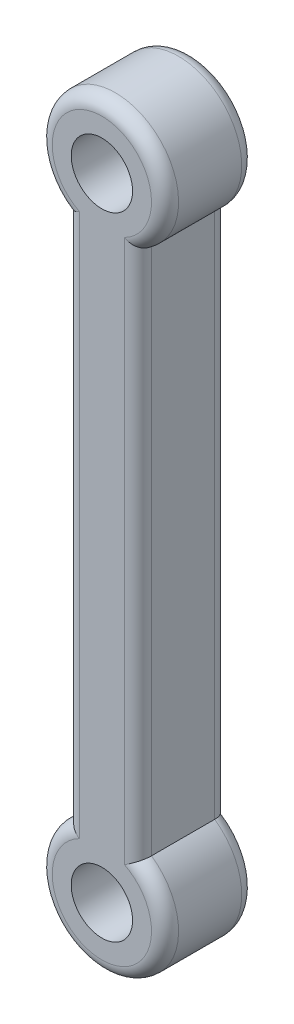
ISO-10303-21;
HEADER;
FILE_DESCRIPTION(('STEP AP214'),'2;1');
FILE_NAME('part.step','',(''),(''),'','','');
FILE_SCHEMA(('AUTOMOTIVE_DESIGN { 1 0 10303 214 1 1 1 1 }'));
ENDSEC;
DATA;
#1=APPLICATION_CONTEXT('core data for automotive mechanical design processes');
#2=APPLICATION_PROTOCOL_DEFINITION('international standard','automotive_design',2000,#1);
#3=PRODUCT_CONTEXT('',#1,'mechanical');
#4=PRODUCT('Part','Part','',(#3));
#5=PRODUCT_RELATED_PRODUCT_CATEGORY('part','',(#4));
#6=PRODUCT_DEFINITION_FORMATION('','',#4);
#7=PRODUCT_DEFINITION_CONTEXT('part definition',#1,'design');
#8=PRODUCT_DEFINITION('design','',#6,#7);
#9=PRODUCT_DEFINITION_SHAPE('','',#8);
#10=(LENGTH_UNIT() NAMED_UNIT(*) SI_UNIT(.MILLI.,.METRE.));
#11=(NAMED_UNIT(*) PLANE_ANGLE_UNIT() SI_UNIT($,.RADIAN.));
#12=(NAMED_UNIT(*) SI_UNIT($,.STERADIAN.) SOLID_ANGLE_UNIT());
#13=UNCERTAINTY_MEASURE_WITH_UNIT(LENGTH_MEASURE(1.E-05),#10,'distance_accuracy_value','');
#14=(GEOMETRIC_REPRESENTATION_CONTEXT(3) GLOBAL_UNCERTAINTY_ASSIGNED_CONTEXT((#13)) GLOBAL_UNIT_ASSIGNED_CONTEXT((#10,
#11,#12)) REPRESENTATION_CONTEXT('',''));
#15=CARTESIAN_POINT('',(0.,0.,0.));
#16=DIRECTION('',(0.,0.,1.));
#17=DIRECTION('',(1.,0.,0.));
#18=AXIS2_PLACEMENT_3D('',#15,#16,#17);
#19=CARTESIAN_POINT('',(0.,17.5,5.));
#20=DIRECTION('',(0.,0.,1.));
#21=DIRECTION('',(1.,0.,0.));
#22=AXIS2_PLACEMENT_3D('',#19,#20,#21);
#23=PLANE('',#22);
#24=CARTESIAN_POINT('',(0.,17.5,5.));
#25=DIRECTION('',(0.,0.,1.));
#26=DIRECTION('',(1.,0.,0.));
#27=AXIS2_PLACEMENT_3D('',#24,#25,#26);
#28=CIRCLE('',#27,2.75);
#29=CARTESIAN_POINT('',(1.24999999999999,15.0505102572168,5.));
#30=VERTEX_POINT('',#29);
#31=CARTESIAN_POINT('',(-1.25000000000002,15.0505102572168,5.));
#32=VERTEX_POINT('',#31);
#33=EDGE_CURVE('E66',#30,#32,#28,.T.);
#34=ORIENTED_EDGE('',*,*,#33,.T.);
#35=DIRECTION('',(0.,-1.,0.));
#36=VECTOR('',#35,1.);
#37=CARTESIAN_POINT('',(-1.25,-14.627718676731,5.));
#38=LINE('',#37,#36);
#39=CARTESIAN_POINT('',(-1.25000000000002,-15.0505102572168,5.));
#40=VERTEX_POINT('',#39);
#41=EDGE_CURVE('E11',#32,#40,#38,.T.);
#42=ORIENTED_EDGE('',*,*,#41,.T.);
#43=CARTESIAN_POINT('',(0.,-17.5,5.));
#44=DIRECTION('',(0.,0.,1.));
#45=DIRECTION('',(1.,0.,0.));
#46=AXIS2_PLACEMENT_3D('',#43,#44,#45);
#47=CIRCLE('',#46,2.75);
#48=CARTESIAN_POINT('',(1.25,-15.0505102572168,5.));
#49=VERTEX_POINT('',#48);
#50=EDGE_CURVE('E55',#40,#49,#47,.T.);
#51=ORIENTED_EDGE('',*,*,#50,.T.);
#52=DIRECTION('',(0.,1.,0.));
#53=VECTOR('',#52,1.);
#54=CARTESIAN_POINT('',(1.24999999999999,14.627718676731,5.));
#55=LINE('',#54,#53);
#56=EDGE_CURVE('E311',#49,#30,#55,.T.);
#57=ORIENTED_EDGE('',*,*,#56,.T.);
#58=EDGE_LOOP('',(#34,#42,#51,#57));
#59=FACE_BOUND('',#58,.T.);
#60=CARTESIAN_POINT('',(0.,-17.5,5.));
#61=DIRECTION('',(0.,0.,1.));
#62=DIRECTION('',(1.,0.,0.));
#63=AXIS2_PLACEMENT_3D('',#60,#61,#62);
#64=CIRCLE('',#63,1.7);
#65=CARTESIAN_POINT('',(1.69999999999999,-17.5,5.));
#66=VERTEX_POINT('',#65);
#67=EDGE_CURVE('E267',#66,#66,#64,.T.);
#68=ORIENTED_EDGE('',*,*,#67,.F.);
#69=EDGE_LOOP('',(#68));
#70=FACE_BOUND('',#69,.T.);
#71=CARTESIAN_POINT('',(0.,17.5,5.));
#72=DIRECTION('',(0.,0.,1.));
#73=DIRECTION('',(1.,0.,0.));
#74=AXIS2_PLACEMENT_3D('',#71,#72,#73);
#75=CIRCLE('',#74,1.7);
#76=CARTESIAN_POINT('',(1.69999999999999,17.5,5.));
#77=VERTEX_POINT('',#76);
#78=EDGE_CURVE('E256',#77,#77,#75,.T.);
#79=ORIENTED_EDGE('',*,*,#78,.F.);
#80=EDGE_LOOP('',(#79));
#81=FACE_BOUND('',#80,.T.);
#82=ADVANCED_FACE('F40',(#59,#70,#81),#23,.T.);
#83=CARTESIAN_POINT('',(0.,17.5,0.));
#84=DIRECTION('',(0.,0.,1.));
#85=DIRECTION('',(1.,0.,0.));
#86=AXIS2_PLACEMENT_3D('',#83,#84,#85);
#87=PLANE('',#86);
#88=DIRECTION('',(0.,-1.,0.));
#89=VECTOR('',#88,1.);
#90=CARTESIAN_POINT('',(-1.25,17.5,0.));
#91=LINE('',#90,#89);
#92=CARTESIAN_POINT('',(-1.25000000000002,-15.0505102572168,0.));
#93=VERTEX_POINT('',#92);
#94=CARTESIAN_POINT('',(-1.25000000000002,15.0505102572168,0.));
#95=VERTEX_POINT('',#94);
#96=EDGE_CURVE('E291',#93,#95,#91,.F.);
#97=ORIENTED_EDGE('',*,*,#96,.T.);
#98=CARTESIAN_POINT('',(0.,17.5,0.));
#99=DIRECTION('',(0.,0.,1.));
#100=DIRECTION('',(1.,0.,0.));
#101=AXIS2_PLACEMENT_3D('',#98,#99,#100);
#102=CIRCLE('',#101,2.75);
#103=CARTESIAN_POINT('',(1.24999999999999,15.0505102572168,0.));
#104=VERTEX_POINT('',#103);
#105=EDGE_CURVE('E123',#95,#104,#102,.F.);
#106=ORIENTED_EDGE('',*,*,#105,.T.);
#107=DIRECTION('',(0.,1.,0.));
#108=VECTOR('',#107,1.);
#109=CARTESIAN_POINT('',(1.25,17.5,0.));
#110=LINE('',#109,#108);
#111=CARTESIAN_POINT('',(1.25,-15.0505102572168,0.));
#112=VERTEX_POINT('',#111);
#113=EDGE_CURVE('E288',#104,#112,#110,.F.);
#114=ORIENTED_EDGE('',*,*,#113,.T.);
#115=CARTESIAN_POINT('',(0.,-17.5,0.));
#116=DIRECTION('',(0.,0.,1.));
#117=DIRECTION('',(1.,0.,0.));
#118=AXIS2_PLACEMENT_3D('',#115,#116,#117);
#119=CIRCLE('',#118,2.75);
#120=EDGE_CURVE('E285',#112,#93,#119,.F.);
#121=ORIENTED_EDGE('',*,*,#120,.T.);
#122=EDGE_LOOP('',(#97,#106,#114,#121));
#123=FACE_BOUND('',#122,.T.);
#124=CARTESIAN_POINT('',(0.,-17.5,0.));
#125=DIRECTION('',(0.,0.,1.));
#126=DIRECTION('',(1.,0.,0.));
#127=AXIS2_PLACEMENT_3D('',#124,#125,#126);
#128=CIRCLE('',#127,1.7);
#129=CARTESIAN_POINT('',(1.69999999999999,-17.5,0.));
#130=VERTEX_POINT('',#129);
#131=EDGE_CURVE('E264',#130,#130,#128,.T.);
#132=ORIENTED_EDGE('',*,*,#131,.T.);
#133=EDGE_LOOP('',(#132));
#134=FACE_BOUND('',#133,.T.);
#135=CARTESIAN_POINT('',(0.,17.5,0.));
#136=DIRECTION('',(0.,0.,1.));
#137=DIRECTION('',(1.,0.,0.));
#138=AXIS2_PLACEMENT_3D('',#135,#136,#137);
#139=CIRCLE('',#138,1.7);
#140=CARTESIAN_POINT('',(1.69999999999999,17.5,0.));
#141=VERTEX_POINT('',#140);
#142=EDGE_CURVE('E193',#141,#141,#139,.T.);
#143=ORIENTED_EDGE('',*,*,#142,.T.);
#144=EDGE_LOOP('',(#143));
#145=FACE_BOUND('',#144,.T.);
#146=ADVANCED_FACE('F226',(#123,#134,#145),#87,.F.);
#147=CARTESIAN_POINT('',(0.,17.5,5.));
#148=DIRECTION('',(0.,0.,-1.));
#149=DIRECTION('',(-1.,0.,0.));
#150=AXIS2_PLACEMENT_3D('',#147,#148,#149);
#151=CYLINDRICAL_SURFACE('',#150,3.5);
#152=DIRECTION('',(0.,0.,-1.));
#153=VECTOR('',#152,1.);
#154=CARTESIAN_POINT('',(1.99999999999995,14.627718676731,5.));
#155=LINE('',#154,#153);
#156=CARTESIAN_POINT('',(1.99999999999995,14.627718676731,4.25));
#157=VERTEX_POINT('',#156);
#158=CARTESIAN_POINT('',(1.99999999999995,14.627718676731,0.750000000000001));
#159=VERTEX_POINT('',#158);
#160=EDGE_CURVE('E271',#157,#159,#155,.T.);
#161=ORIENTED_EDGE('',*,*,#160,.T.);
#162=CARTESIAN_POINT('',(0.,17.5,0.750000000000001));
#163=DIRECTION('',(0.,0.,1.));
#164=DIRECTION('',(1.,0.,0.));
#165=AXIS2_PLACEMENT_3D('',#162,#163,#164);
#166=CIRCLE('',#165,3.5);
#167=CARTESIAN_POINT('',(-2.,14.627718676731,0.750000000000001));
#168=VERTEX_POINT('',#167);
#169=EDGE_CURVE('E133',#159,#168,#166,.T.);
#170=ORIENTED_EDGE('',*,*,#169,.T.);
#171=DIRECTION('',(0.,0.,-1.));
#172=VECTOR('',#171,1.);
#173=CARTESIAN_POINT('',(-2.,14.627718676731,5.));
#174=LINE('',#173,#172);
#175=CARTESIAN_POINT('',(-2.,14.627718676731,4.25));
#176=VERTEX_POINT('',#175);
#177=EDGE_CURVE('E115',#176,#168,#174,.T.);
#178=ORIENTED_EDGE('',*,*,#177,.F.);
#179=CARTESIAN_POINT('',(0.,17.5,4.25));
#180=DIRECTION('',(0.,0.,1.));
#181=DIRECTION('',(1.,0.,0.));
#182=AXIS2_PLACEMENT_3D('',#179,#180,#181);
#183=CIRCLE('',#182,3.5);
#184=EDGE_CURVE('E130',#176,#157,#183,.F.);
#185=ORIENTED_EDGE('',*,*,#184,.T.);
#186=EDGE_LOOP('',(#161,#170,#178,#185));
#187=FACE_BOUND('',#186,.T.);
#188=ADVANCED_FACE('F129',(#187),#151,.T.);
#189=CARTESIAN_POINT('',(-2.00000000000001,-14.627718676731,5.));
#190=DIRECTION('',(1.,0.,0.));
#191=DIRECTION('',(0.,0.,-1.));
#192=AXIS2_PLACEMENT_3D('',#189,#190,#191);
#193=PLANE('',#192);
#194=ORIENTED_EDGE('',*,*,#177,.T.);
#195=DIRECTION('',(0.,-1.,0.));
#196=VECTOR('',#195,1.);
#197=CARTESIAN_POINT('',(-2.00000000000001,-14.627718676731,0.750000000000001));
#198=LINE('',#197,#196);
#199=CARTESIAN_POINT('',(-2.00000000000001,-14.627718676731,0.750000000000001));
#200=VERTEX_POINT('',#199);
#201=EDGE_CURVE('E122',#168,#200,#198,.T.);
#202=ORIENTED_EDGE('',*,*,#201,.T.);
#203=DIRECTION('',(0.,0.,-1.));
#204=VECTOR('',#203,1.);
#205=CARTESIAN_POINT('',(-2.00000000000001,-14.627718676731,5.));
#206=LINE('',#205,#204);
#207=CARTESIAN_POINT('',(-2.00000000000001,-14.627718676731,4.25));
#208=VERTEX_POINT('',#207);
#209=EDGE_CURVE('E117',#208,#200,#206,.T.);
#210=ORIENTED_EDGE('',*,*,#209,.F.);
#211=DIRECTION('',(0.,-1.,0.));
#212=VECTOR('',#211,1.);
#213=CARTESIAN_POINT('',(-2.,14.627718676731,4.25));
#214=LINE('',#213,#212);
#215=EDGE_CURVE('E112',#208,#176,#214,.F.);
#216=ORIENTED_EDGE('',*,*,#215,.T.);
#217=EDGE_LOOP('',(#194,#202,#210,#216));
#218=FACE_BOUND('',#217,.T.);
#219=ADVANCED_FACE('F114',(#218),#193,.F.);
#220=CARTESIAN_POINT('',(0.,-17.5,5.));
#221=DIRECTION('',(0.,0.,-1.));
#222=DIRECTION('',(-1.,0.,0.));
#223=AXIS2_PLACEMENT_3D('',#220,#221,#222);
#224=CYLINDRICAL_SURFACE('',#223,3.5);
#225=ORIENTED_EDGE('',*,*,#209,.T.);
#226=CARTESIAN_POINT('',(0.,-17.5,0.750000000000001));
#227=DIRECTION('',(0.,0.,1.));
#228=DIRECTION('',(1.,0.,0.));
#229=AXIS2_PLACEMENT_3D('',#226,#227,#228);
#230=CIRCLE('',#229,3.5);
#231=CARTESIAN_POINT('',(1.99999999999993,-14.627718676731,0.750000000000001));
#232=VERTEX_POINT('',#231);
#233=EDGE_CURVE('E308',#200,#232,#230,.T.);
#234=ORIENTED_EDGE('',*,*,#233,.T.);
#235=DIRECTION('',(0.,0.,-1.));
#236=VECTOR('',#235,1.);
#237=CARTESIAN_POINT('',(1.99999999999993,-14.627718676731,5.));
#238=LINE('',#237,#236);
#239=CARTESIAN_POINT('',(1.99999999999993,-14.627718676731,4.25));
#240=VERTEX_POINT('',#239);
#241=EDGE_CURVE('E277',#240,#232,#238,.T.);
#242=ORIENTED_EDGE('',*,*,#241,.F.);
#243=CARTESIAN_POINT('',(0.,-17.5,4.25));
#244=DIRECTION('',(0.,0.,1.));
#245=DIRECTION('',(1.,0.,0.));
#246=AXIS2_PLACEMENT_3D('',#243,#244,#245);
#247=CIRCLE('',#246,3.5);
#248=EDGE_CURVE('E305',#240,#208,#247,.F.);
#249=ORIENTED_EDGE('',*,*,#248,.T.);
#250=EDGE_LOOP('',(#225,#234,#242,#249));
#251=FACE_BOUND('',#250,.T.);
#252=ADVANCED_FACE('F229',(#251),#224,.T.);
#253=CARTESIAN_POINT('',(1.99999999999992,-14.627718676731,5.));
#254=DIRECTION('',(-1.,0.,0.));
#255=DIRECTION('',(0.,0.,1.));
#256=AXIS2_PLACEMENT_3D('',#253,#254,#255);
#257=PLANE('',#256);
#258=ORIENTED_EDGE('',*,*,#241,.T.);
#259=DIRECTION('',(0.,1.,0.));
#260=VECTOR('',#259,1.);
#261=CARTESIAN_POINT('',(1.99999999999992,-14.627718676731,0.750000000000001));
#262=LINE('',#261,#260);
#263=EDGE_CURVE('E302',#232,#159,#262,.T.);
#264=ORIENTED_EDGE('',*,*,#263,.T.);
#265=ORIENTED_EDGE('',*,*,#160,.F.);
#266=DIRECTION('',(0.,1.,0.));
#267=VECTOR('',#266,1.);
#268=CARTESIAN_POINT('',(1.99999999999993,-14.627718676731,4.25));
#269=LINE('',#268,#267);
#270=EDGE_CURVE('E299',#157,#240,#269,.F.);
#271=ORIENTED_EDGE('',*,*,#270,.T.);
#272=EDGE_LOOP('',(#258,#264,#265,#271));
#273=FACE_BOUND('',#272,.T.);
#274=ADVANCED_FACE('F232',(#273),#257,.F.);
#275=CARTESIAN_POINT('',(0.,-17.5,5.));
#276=DIRECTION('',(0.,0.,-1.));
#277=DIRECTION('',(-1.,0.,0.));
#278=AXIS2_PLACEMENT_3D('',#275,#276,#277);
#279=CYLINDRICAL_SURFACE('',#278,1.7);
#280=ORIENTED_EDGE('',*,*,#67,.T.);
#281=EDGE_LOOP('',(#280));
#282=FACE_BOUND('',#281,.T.);
#283=ORIENTED_EDGE('',*,*,#131,.F.);
#284=EDGE_LOOP('',(#283));
#285=FACE_BOUND('',#284,.T.);
#286=ADVANCED_FACE('F236',(#282,#285),#279,.F.);
#287=CARTESIAN_POINT('',(0.,17.5,5.));
#288=DIRECTION('',(0.,0.,-1.));
#289=DIRECTION('',(-1.,0.,0.));
#290=AXIS2_PLACEMENT_3D('',#287,#288,#289);
#291=CYLINDRICAL_SURFACE('',#290,1.7);
#292=ORIENTED_EDGE('',*,*,#78,.T.);
#293=EDGE_LOOP('',(#292));
#294=FACE_BOUND('',#293,.T.);
#295=ORIENTED_EDGE('',*,*,#142,.F.);
#296=EDGE_LOOP('',(#295));
#297=FACE_BOUND('',#296,.T.);
#298=ADVANCED_FACE('F245',(#294,#297),#291,.F.);
#299=CARTESIAN_POINT('',(0.,-17.5,0.750000000000001));
#300=DIRECTION('',(0.,0.,1.));
#301=DIRECTION('',(1.,0.,0.));
#302=AXIS2_PLACEMENT_3D('',#299,#300,#301);
#303=TOROIDAL_SURFACE('',#302,2.75,0.75);
#304=CARTESIAN_POINT('',(-2.,-14.627718676731,0.750000000000001));
#305=CARTESIAN_POINT('',(-2.00000095325139,-14.6277184380373,0.730675526344662));
#306=CARTESIAN_POINT('',(-1.9992525688487,-14.6281089826292,0.711360936222169));
#307=CARTESIAN_POINT('',(-1.99627424982253,-14.6296648887274,0.672882704881048));
#308=CARTESIAN_POINT('',(-1.99404470038907,-14.6308300487882,0.653719025727422));
#309=CARTESIAN_POINT('',(-1.9851853415741,-14.6354640650265,0.596802648427942));
#310=CARTESIAN_POINT('',(-1.97638447728872,-14.6400716010906,0.559453123479981));
#311=CARTESIAN_POINT('',(-1.95340221103496,-14.6521512369574,0.486994207855807));
#312=CARTESIAN_POINT('',(-1.93922367204549,-14.6596218125506,0.451883636798321));
#313=CARTESIAN_POINT('',(-1.90608780115928,-14.6771751313508,0.384688114777164));
#314=CARTESIAN_POINT('',(-1.88712766361705,-14.6872594082671,0.352604955415005));
#315=CARTESIAN_POINT('',(-1.84429220721255,-14.7101947947676,0.290886192530704));
#316=CARTESIAN_POINT('',(-1.82024732758604,-14.7231423410526,0.261404735108063));
#317=CARTESIAN_POINT('',(-1.76861818996254,-14.7511728049644,0.206911260304115));
#318=CARTESIAN_POINT('',(-1.74103304512402,-14.7662562577371,0.181900366574537));
#319=CARTESIAN_POINT('',(-1.68006819436874,-14.7999043802964,0.13421294068312));
#320=CARTESIAN_POINT('',(-1.64638422956726,-14.8186686626426,0.112067097720287));
#321=CARTESIAN_POINT('',(-1.57670265513905,-14.8579375600058,0.0737238775661498));
#322=CARTESIAN_POINT('',(-1.54070289395297,-14.8784437992777,0.0575321287943022));
#323=CARTESIAN_POINT('',(-1.46344331662631,-14.9230100379806,0.0297209935896275));
#324=CARTESIAN_POINT('',(-1.42202995025203,-14.9472164873707,0.0187665914594761));
#325=CARTESIAN_POINT('',(-1.33865282455479,-14.9966885122841,0.00405890903843752));
#326=CARTESIAN_POINT('',(-1.29669025481343,-15.0219519973025,0.000292043517123486));
#327=CARTESIAN_POINT('',(-1.25329968550074,-15.0484902410092,5.43429847254327E-06));
#328=CARTESIAN_POINT('',(-1.25164965235721,-15.0495000505079,-9.07586956553914E-09));
#329=CARTESIAN_POINT('',(-1.25000000000002,-15.0505102572168,0.));
#330=B_SPLINE_CURVE_WITH_KNOTS('',3,(#304,#305,#306,#307,#308,#309,#310,#311,#312,#313,#314,
#315,#316,#317,#318,#319,#320,#321,#322,#323,#324,#325,#326,#327,#328,#329),.UNSPECIFIED.,.F.,
.F.,(4,2,2,2,2,2,2,2,2,2,2,2,4),(0.,0.0579356663711848,0.115856271956792,0.231189950300521,
0.346462313024947,0.461802470843837,0.581868497571116,0.701964659931743,0.834825964767603,
0.967812542799761,1.11486883078252,1.26164688989133,1.26745040204933),.UNSPECIFIED.);
#331=EDGE_CURVE('E194',#93,#200,#330,.F.);
#332=ORIENTED_EDGE('',*,*,#331,.F.);
#333=ORIENTED_EDGE('',*,*,#120,.F.);
#334=CARTESIAN_POINT('',(1.99999999999993,-14.627718676731,0.750000000000001));
#335=CARTESIAN_POINT('',(2.00000095325136,-14.6277184380373,0.730675526344661));
#336=CARTESIAN_POINT('',(1.99925256884869,-14.6281089826292,0.711360936222166));
#337=CARTESIAN_POINT('',(1.99627424982253,-14.6296648887274,0.672882704881043));
#338=CARTESIAN_POINT('',(1.99404470038907,-14.6308300487882,0.653719025727417));
#339=CARTESIAN_POINT('',(1.98518534157408,-14.6354640650265,0.596802648427939));
#340=CARTESIAN_POINT('',(1.97638447728865,-14.6400716010905,0.559453123479983));
#341=CARTESIAN_POINT('',(1.9534022110349,-14.6521512369573,0.486994207855806));
#342=CARTESIAN_POINT('',(1.93922367204547,-14.6596218125506,0.451883636798313));
#343=CARTESIAN_POINT('',(1.90608780115928,-14.6771751313508,0.384688114777155));
#344=CARTESIAN_POINT('',(1.88712766361701,-14.687259408267,0.352604955415005));
#345=CARTESIAN_POINT('',(1.84429220721252,-14.7101947947675,0.290886192530707));
#346=CARTESIAN_POINT('',(1.82024732758604,-14.7231423410526,0.261404735108061));
#347=CARTESIAN_POINT('',(1.76861818996254,-14.7511728049644,0.206911260304124));
#348=CARTESIAN_POINT('',(1.741033045124,-14.7662562577371,0.181900366574562));
#349=CARTESIAN_POINT('',(1.68006819436872,-14.7999043802964,0.134212940683145));
#350=CARTESIAN_POINT('',(1.64638422956725,-14.8186686626426,0.112067097720294));
#351=CARTESIAN_POINT('',(1.57670265513904,-14.8579375600058,0.0737238775661433));
#352=CARTESIAN_POINT('',(1.54070289395293,-14.8784437992777,0.0575321287943012));
#353=CARTESIAN_POINT('',(1.46344331662627,-14.9230100379806,0.0297209935896278));
#354=CARTESIAN_POINT('',(1.42202995025202,-14.9472164873708,0.0187665914594715));
#355=CARTESIAN_POINT('',(1.33865282455474,-14.9966885122841,0.00405890903843279));
#356=CARTESIAN_POINT('',(1.29669025481331,-15.0219519973024,0.000292043517123307));
#357=CARTESIAN_POINT('',(1.25329968550069,-15.0484902410092,5.43429847262515E-06));
#358=CARTESIAN_POINT('',(1.25164965235718,-15.0495000505079,-9.07586948350681E-09));
#359=CARTESIAN_POINT('',(1.25,-15.0505102572168,0.));
#360=B_SPLINE_CURVE_WITH_KNOTS('',3,(#334,#335,#336,#337,#338,#339,#340,#341,#342,#343,#344,
#345,#346,#347,#348,#349,#350,#351,#352,#353,#354,#355,#356,#357,#358,#359),.UNSPECIFIED.,.F.,
.F.,(4,2,2,2,2,2,2,2,2,2,2,2,4),(0.,0.0579356663711888,0.115856271956793,0.231189950300527,
0.346462313024951,0.461802470843838,0.581868497571104,0.701964659931719,0.834825964767592,
0.967812542799761,1.11486883078254,1.26164688989136,1.26745040204933),.UNSPECIFIED.);
#361=EDGE_CURVE('E185',#232,#112,#360,.T.);
#362=ORIENTED_EDGE('',*,*,#361,.F.);
#363=ORIENTED_EDGE('',*,*,#233,.F.);
#364=EDGE_LOOP('',(#332,#333,#362,#363));
#365=FACE_BOUND('',#364,.T.);
#366=ADVANCED_FACE('F174',(#365),#303,.T.);
#367=CARTESIAN_POINT('',(1.25,-14.627718676731,0.750000000000001));
#368=DIRECTION('',(0.,1.,0.));
#369=DIRECTION('',(0.,0.,1.));
#370=AXIS2_PLACEMENT_3D('',#367,#368,#369);
#371=CYLINDRICAL_SURFACE('',#370,0.75);
#372=ORIENTED_EDGE('',*,*,#361,.T.);
#373=ORIENTED_EDGE('',*,*,#113,.F.);
#374=CARTESIAN_POINT('',(1.99999999999995,14.627718676731,0.750000000000001));
#375=CARTESIAN_POINT('',(2.00000095325137,14.6277184380373,0.730675526344662));
#376=CARTESIAN_POINT('',(1.99925256884869,14.6281089826292,0.711360936222169));
#377=CARTESIAN_POINT('',(1.99627424982253,14.6296648887274,0.672882704881048));
#378=CARTESIAN_POINT('',(1.99404470038906,14.6308300487882,0.653719025727421));
#379=CARTESIAN_POINT('',(1.98518534157409,14.6354640650265,0.596802648427942));
#380=CARTESIAN_POINT('',(1.97638447728871,14.6400716010906,0.55945312347998));
#381=CARTESIAN_POINT('',(1.95340221103496,14.6521512369574,0.486994207855806));
#382=CARTESIAN_POINT('',(1.93922367204549,14.6596218125506,0.451883636798321));
#383=CARTESIAN_POINT('',(1.90608780115927,14.6771751313508,0.384688114777165));
#384=CARTESIAN_POINT('',(1.88712766361703,14.6872594082671,0.352604955415007));
#385=CARTESIAN_POINT('',(1.84429220721254,14.7101947947676,0.290886192530706));
#386=CARTESIAN_POINT('',(1.82024732758604,14.7231423410526,0.261404735108064));
#387=CARTESIAN_POINT('',(1.76861818996254,14.7511728049644,0.206911260304128));
#388=CARTESIAN_POINT('',(1.741033045124,14.7662562577371,0.181900366574562));
#389=CARTESIAN_POINT('',(1.68006819436872,14.7999043802964,0.134212940683145));
#390=CARTESIAN_POINT('',(1.64638422956725,14.8186686626426,0.112067097720297));
#391=CARTESIAN_POINT('',(1.57670265513905,14.8579375600058,0.0737238775661471));
#392=CARTESIAN_POINT('',(1.54070289395295,14.8784437992777,0.0575321287943021));
#393=CARTESIAN_POINT('',(1.46344331662629,14.9230100379807,0.0297209935896276));
#394=CARTESIAN_POINT('',(1.42202995025202,14.9472164873708,0.0187665914594732));
#395=CARTESIAN_POINT('',(1.33865282455475,14.9966885122841,0.0040589090384345));
#396=CARTESIAN_POINT('',(1.29669025481334,15.0219519973024,0.000292043517123372));
#397=CARTESIAN_POINT('',(1.2532996855007,15.0484902410092,5.43429847260587E-06));
#398=CARTESIAN_POINT('',(1.25164965235718,15.0495000505079,-9.07586950284625E-09));
#399=CARTESIAN_POINT('',(1.24999999999999,15.0505102572168,0.));
#400=B_SPLINE_CURVE_WITH_KNOTS('',3,(#374,#375,#376,#377,#378,#379,#380,#381,#382,#383,#384,
#385,#386,#387,#388,#389,#390,#391,#392,#393,#394,#395,#396,#397,#398,#399),.UNSPECIFIED.,.F.,
.F.,(4,2,2,2,2,2,2,2,2,2,2,2,4),(0.,0.0579356663711842,0.115856271956791,0.231189950300518,
0.346462313024947,0.46180247084384,0.581868497571106,0.701964659931719,0.834825964767592,
0.967812542799763,1.11486883078254,1.26164688989136,1.26745040204934),.UNSPECIFIED.);
#401=EDGE_CURVE('E149',#159,#104,#400,.T.);
#402=ORIENTED_EDGE('',*,*,#401,.F.);
#403=ORIENTED_EDGE('',*,*,#263,.F.);
#404=EDGE_LOOP('',(#372,#373,#402,#403));
#405=FACE_BOUND('',#404,.T.);
#406=ADVANCED_FACE('F201',(#405),#371,.T.);
#407=CARTESIAN_POINT('',(-1.25,-14.627718676731,0.750000000000001));
#408=DIRECTION('',(0.,-1.,0.));
#409=DIRECTION('',(0.,0.,-1.));
#410=AXIS2_PLACEMENT_3D('',#407,#408,#409);
#411=CYLINDRICAL_SURFACE('',#410,0.75);
#412=ORIENTED_EDGE('',*,*,#331,.T.);
#413=ORIENTED_EDGE('',*,*,#201,.F.);
#414=CARTESIAN_POINT('',(-2.,14.627718676731,0.750000000000001));
#415=CARTESIAN_POINT('',(-2.0000009532514,14.6277184380373,0.730675526344663));
#416=CARTESIAN_POINT('',(-1.9992525688487,14.6281089826292,0.711360936222172));
#417=CARTESIAN_POINT('',(-1.99627424982253,14.6296648887274,0.672882704881052));
#418=CARTESIAN_POINT('',(-1.99404470038907,14.6308300487882,0.653719025727425));
#419=CARTESIAN_POINT('',(-1.9851853415741,14.6354640650265,0.596802648427944));
#420=CARTESIAN_POINT('',(-1.97638447728873,14.6400716010906,0.55945312347998));
#421=CARTESIAN_POINT('',(-1.95340221103497,14.6521512369574,0.486994207855807));
#422=CARTESIAN_POINT('',(-1.9392236720455,14.6596218125506,0.451883636798326));
#423=CARTESIAN_POINT('',(-1.90608780115928,14.6771751313508,0.384688114777169));
#424=CARTESIAN_POINT('',(-1.88712766361705,14.6872594082671,0.352604955415006));
#425=CARTESIAN_POINT('',(-1.84429220721256,14.7101947947675,0.290886192530706));
#426=CARTESIAN_POINT('',(-1.82024732758606,14.7231423410526,0.261404735108069));
#427=CARTESIAN_POINT('',(-1.76861818996255,14.7511728049644,0.206911260304134));
#428=CARTESIAN_POINT('',(-1.74103304512402,14.7662562577371,0.181900366574564));
#429=CARTESIAN_POINT('',(-1.68006819436874,14.7999043802964,0.134212940683144));
#430=CARTESIAN_POINT('',(-1.64638422956727,14.8186686626426,0.112067097720299));
#431=CARTESIAN_POINT('',(-1.57670265513906,14.8579375600058,0.0737238775661496));
#432=CARTESIAN_POINT('',(-1.54070289395296,14.8784437992777,0.0575321287943026));
#433=CARTESIAN_POINT('',(-1.4634433166263,14.9230100379807,0.0297209935896266));
#434=CARTESIAN_POINT('',(-1.42202995025204,14.9472164873708,0.0187665914594732));
#435=CARTESIAN_POINT('',(-1.33865282455476,14.9966885122841,0.00405890903843505));
#436=CARTESIAN_POINT('',(-1.29669025481333,15.0219519973024,0.000292043517123392));
#437=CARTESIAN_POINT('',(-1.25329968550071,15.0484902410092,5.43429847261618E-06));
#438=CARTESIAN_POINT('',(-1.25164965235719,15.0495000505079,-9.07586949256968E-09));
#439=CARTESIAN_POINT('',(-1.25000000000002,15.0505102572168,0.));
#440=B_SPLINE_CURVE_WITH_KNOTS('',3,(#414,#415,#416,#417,#418,#419,#420,#421,#422,#423,#424,
#425,#426,#427,#428,#429,#430,#431,#432,#433,#434,#435,#436,#437,#438,#439),.UNSPECIFIED.,.F.,
.F.,(4,2,2,2,2,2,2,2,2,2,2,2,4),(0.,0.0579356663711815,0.115856271956788,0.231189950300518,
0.346462313024945,0.461802470843834,0.581868497571102,0.701964659931719,0.834825964767592,
0.967812542799762,1.11486883078254,1.26164688989136,1.26745040204933),.UNSPECIFIED.);
#441=EDGE_CURVE('E145',#95,#168,#440,.F.);
#442=ORIENTED_EDGE('',*,*,#441,.F.);
#443=ORIENTED_EDGE('',*,*,#96,.F.);
#444=EDGE_LOOP('',(#412,#413,#442,#443));
#445=FACE_BOUND('',#444,.T.);
#446=ADVANCED_FACE('F204',(#445),#411,.T.);
#447=CARTESIAN_POINT('',(0.,17.5,0.750000000000001));
#448=DIRECTION('',(0.,0.,1.));
#449=DIRECTION('',(1.,0.,0.));
#450=AXIS2_PLACEMENT_3D('',#447,#448,#449);
#451=TOROIDAL_SURFACE('',#450,2.75,0.75);
#452=ORIENTED_EDGE('',*,*,#401,.T.);
#453=ORIENTED_EDGE('',*,*,#105,.F.);
#454=ORIENTED_EDGE('',*,*,#441,.T.);
#455=ORIENTED_EDGE('',*,*,#169,.F.);
#456=EDGE_LOOP('',(#452,#453,#454,#455));
#457=FACE_BOUND('',#456,.T.);
#458=ADVANCED_FACE('F218',(#457),#451,.T.);
#459=CARTESIAN_POINT('',(0.,17.5,4.25));
#460=DIRECTION('',(0.,0.,1.));
#461=DIRECTION('',(1.,0.,0.));
#462=AXIS2_PLACEMENT_3D('',#459,#460,#461);
#463=TOROIDAL_SURFACE('',#462,2.75,0.75);
#464=CARTESIAN_POINT('',(1.99999999999995,14.627718676731,4.25));
#465=CARTESIAN_POINT('',(2.00000095325137,14.6277184380373,4.26932447365534));
#466=CARTESIAN_POINT('',(1.99925256884869,14.6281089826292,4.28863906377783));
#467=CARTESIAN_POINT('',(1.99627424982253,14.6296648887274,4.32711729511895));
#468=CARTESIAN_POINT('',(1.99404470038907,14.6308300487882,4.34628097427257));
#469=CARTESIAN_POINT('',(1.98518534157409,14.6354640650265,4.40319735157204));
#470=CARTESIAN_POINT('',(1.97638447728871,14.6400716010906,4.44054687652));
#471=CARTESIAN_POINT('',(1.95340221103496,14.6521512369574,4.51300579214418));
#472=CARTESIAN_POINT('',(1.93922367204549,14.6596218125506,4.54811636320167));
#473=CARTESIAN_POINT('',(1.90608780115928,14.6771751313508,4.61531188522283));
#474=CARTESIAN_POINT('',(1.88712766361703,14.6872594082671,4.64739504458499));
#475=CARTESIAN_POINT('',(1.84429220721254,14.7101947947676,4.7091138074693));
#476=CARTESIAN_POINT('',(1.82024732758604,14.7231423410526,4.73859526489194));
#477=CARTESIAN_POINT('',(1.76861818996254,14.7511728049644,4.79308873969588));
#478=CARTESIAN_POINT('',(1.74103304512401,14.7662562577371,4.81809963342544));
#479=CARTESIAN_POINT('',(1.68006819436872,14.7999043802964,4.86578705931686));
#480=CARTESIAN_POINT('',(1.64638422956725,14.8186686626426,4.88793290227971));
#481=CARTESIAN_POINT('',(1.57670265513905,14.8579375600058,4.92627612243386));
#482=CARTESIAN_POINT('',(1.54070289395296,14.8784437992777,4.9424678712057));
#483=CARTESIAN_POINT('',(1.46344331662628,14.9230100379807,4.97027900641038));
#484=CARTESIAN_POINT('',(1.422029950252,14.9472164873707,4.98123340854053));
#485=CARTESIAN_POINT('',(1.33865282455477,14.9966885122841,4.99594109096157));
#486=CARTESIAN_POINT('',(1.29669025481342,15.0219519973026,4.99970795648288));
#487=CARTESIAN_POINT('',(1.2532996855007,15.0484902410092,4.99999456570153));
#488=CARTESIAN_POINT('',(1.25164965235718,15.0495000505079,5.00000000907587));
#489=CARTESIAN_POINT('',(1.24999999999999,15.0505102572168,5.));
#490=B_SPLINE_CURVE_WITH_KNOTS('',3,(#464,#465,#466,#467,#468,#469,#470,#471,#472,#473,#474,
#475,#476,#477,#478,#479,#480,#481,#482,#483,#484,#485,#486,#487,#488,#489),.UNSPECIFIED.,.F.,
.F.,(4,2,2,2,2,2,2,2,2,2,2,2,4),(0.,0.0579356663711776,0.115856271956776,0.231189950300491,
0.346462313024934,0.461802470843839,0.581868497571104,0.701964659931718,0.834825964767591,
0.967812542799762,1.11486883078253,1.26164688989136,1.26745040204934),.UNSPECIFIED.);
#491=EDGE_CURVE('E139',#157,#30,#490,.T.);
#492=ORIENTED_EDGE('',*,*,#491,.F.);
#493=ORIENTED_EDGE('',*,*,#184,.F.);
#494=CARTESIAN_POINT('',(-2.,14.627718676731,4.25));
#495=CARTESIAN_POINT('',(-2.00000095325139,14.6277184380373,4.26932447365534));
#496=CARTESIAN_POINT('',(-1.9992525688487,14.6281089826292,4.28863906377783));
#497=CARTESIAN_POINT('',(-1.99627424982253,14.6296648887274,4.32711729511894));
#498=CARTESIAN_POINT('',(-1.99404470038907,14.6308300487882,4.34628097427257));
#499=CARTESIAN_POINT('',(-1.9851853415741,14.6354640650265,4.40319735157204));
#500=CARTESIAN_POINT('',(-1.97638447728872,14.6400716010906,4.44054687652));
#501=CARTESIAN_POINT('',(-1.95340221103497,14.6521512369574,4.51300579214417));
#502=CARTESIAN_POINT('',(-1.9392236720455,14.6596218125506,4.54811636320166));
#503=CARTESIAN_POINT('',(-1.90608780115929,14.6771751313508,4.61531188522283));
#504=CARTESIAN_POINT('',(-1.88712766361705,14.6872594082671,4.64739504458499));
#505=CARTESIAN_POINT('',(-1.84429220721256,14.7101947947675,4.7091138074693));
#506=CARTESIAN_POINT('',(-1.82024732758606,14.7231423410526,4.73859526489193));
#507=CARTESIAN_POINT('',(-1.76861818996255,14.7511728049644,4.79308873969587));
#508=CARTESIAN_POINT('',(-1.74103304512402,14.7662562577371,4.81809963342544));
#509=CARTESIAN_POINT('',(-1.68006819436874,14.7999043802964,4.86578705931686));
#510=CARTESIAN_POINT('',(-1.64638422956727,14.8186686626426,4.8879329022797));
#511=CARTESIAN_POINT('',(-1.57670265513906,14.8579375600058,4.92627612243385));
#512=CARTESIAN_POINT('',(-1.54070289395296,14.8784437992777,4.9424678712057));
#513=CARTESIAN_POINT('',(-1.4634433166263,14.9230100379807,4.97027900641038));
#514=CARTESIAN_POINT('',(-1.42202995025204,14.9472164873708,4.98123340854053));
#515=CARTESIAN_POINT('',(-1.33865282455476,14.9966885122841,4.99594109096157));
#516=CARTESIAN_POINT('',(-1.29669025481333,15.0219519973024,4.99970795648288));
#517=CARTESIAN_POINT('',(-1.25329968550071,15.0484902410092,4.99999456570153));
#518=CARTESIAN_POINT('',(-1.25164965235719,15.0495000505079,5.00000000907587));
#519=CARTESIAN_POINT('',(-1.25000000000002,15.0505102572168,5.));
#520=B_SPLINE_CURVE_WITH_KNOTS('',3,(#494,#495,#496,#497,#498,#499,#500,#501,#502,#503,#504,
#505,#506,#507,#508,#509,#510,#511,#512,#513,#514,#515,#516,#517,#518,#519),.UNSPECIFIED.,.F.,
.F.,(4,2,2,2,2,2,2,2,2,2,2,2,4),(0.,0.0579356663711737,0.115856271956774,0.23118995030049,
0.346462313024928,0.461802470843831,0.581868497571098,0.701964659931716,0.834825964767588,
0.967812542799759,1.11486883078254,1.26164688989136,1.26745040204933),.UNSPECIFIED.);
#521=EDGE_CURVE('E45',#32,#176,#520,.F.);
#522=ORIENTED_EDGE('',*,*,#521,.F.);
#523=ORIENTED_EDGE('',*,*,#33,.F.);
#524=EDGE_LOOP('',(#492,#493,#522,#523));
#525=FACE_BOUND('',#524,.T.);
#526=ADVANCED_FACE('F42',(#525),#463,.T.);
#527=CARTESIAN_POINT('',(-1.25,17.5,4.25));
#528=DIRECTION('',(0.,1.,0.));
#529=DIRECTION('',(0.,0.,1.));
#530=AXIS2_PLACEMENT_3D('',#527,#528,#529);
#531=CYLINDRICAL_SURFACE('',#530,0.75);
#532=ORIENTED_EDGE('',*,*,#521,.T.);
#533=ORIENTED_EDGE('',*,*,#215,.F.);
#534=CARTESIAN_POINT('',(-2.,-14.627718676731,4.25));
#535=CARTESIAN_POINT('',(-2.00000095325139,-14.6277184380373,4.26932447365534));
#536=CARTESIAN_POINT('',(-1.9992525688487,-14.6281089826292,4.28863906377783));
#537=CARTESIAN_POINT('',(-1.99627424982253,-14.6296648887273,4.32711729511894));
#538=CARTESIAN_POINT('',(-1.99404470038907,-14.6308300487881,4.34628097427257));
#539=CARTESIAN_POINT('',(-1.9851853415741,-14.6354640650265,4.40319735157204));
#540=CARTESIAN_POINT('',(-1.97638447728872,-14.6400716010906,4.44054687652));
#541=CARTESIAN_POINT('',(-1.95340221103496,-14.6521512369574,4.51300579214417));
#542=CARTESIAN_POINT('',(-1.93922367204549,-14.6596218125506,4.54811636320167));
#543=CARTESIAN_POINT('',(-1.90608780115928,-14.6771751313508,4.61531188522283));
#544=CARTESIAN_POINT('',(-1.88712766361705,-14.6872594082671,4.647395044585));
#545=CARTESIAN_POINT('',(-1.84429220721256,-14.7101947947676,4.7091138074693));
#546=CARTESIAN_POINT('',(-1.82024732758605,-14.7231423410526,4.73859526489194));
#547=CARTESIAN_POINT('',(-1.76861818996254,-14.7511728049644,4.79308873969588));
#548=CARTESIAN_POINT('',(-1.74103304512402,-14.7662562577371,4.81809963342544));
#549=CARTESIAN_POINT('',(-1.68006819436874,-14.7999043802964,4.86578705931686));
#550=CARTESIAN_POINT('',(-1.64638422956726,-14.8186686626426,4.88793290227971));
#551=CARTESIAN_POINT('',(-1.57670265513905,-14.8579375600058,4.92627612243386));
#552=CARTESIAN_POINT('',(-1.54070289395297,-14.8784437992777,4.9424678712057));
#553=CARTESIAN_POINT('',(-1.46344331662631,-14.9230100379807,4.97027900641038));
#554=CARTESIAN_POINT('',(-1.42202995025203,-14.9472164873707,4.98123340854053));
#555=CARTESIAN_POINT('',(-1.33865282455476,-14.9966885122841,4.99594109096157));
#556=CARTESIAN_POINT('',(-1.29669025481337,-15.0219519973025,4.99970795648288));
#557=CARTESIAN_POINT('',(-1.25329968550072,-15.0484902410092,4.99999456570153));
#558=CARTESIAN_POINT('',(-1.2516496523572,-15.0495000505079,5.00000000907587));
#559=CARTESIAN_POINT('',(-1.25000000000002,-15.0505102572168,5.));
#560=B_SPLINE_CURVE_WITH_KNOTS('',3,(#534,#535,#536,#537,#538,#539,#540,#541,#542,#543,#544,
#545,#546,#547,#548,#549,#550,#551,#552,#553,#554,#555,#556,#557,#558,#559),.UNSPECIFIED.,.F.,
.F.,(4,2,2,2,2,2,2,2,2,2,2,2,4),(0.,0.0579356663711769,0.115856271956774,0.231189950300494,
0.346462313024933,0.461802470843834,0.581868497571103,0.701964659931722,0.834825964767591,
0.967812542799755,1.11486883078253,1.26164688989135,1.26745040204933),.UNSPECIFIED.);
#561=EDGE_CURVE('E151',#40,#208,#560,.F.);
#562=ORIENTED_EDGE('',*,*,#561,.F.);
#563=ORIENTED_EDGE('',*,*,#41,.F.);
#564=EDGE_LOOP('',(#532,#533,#562,#563));
#565=FACE_BOUND('',#564,.T.);
#566=ADVANCED_FACE('F143',(#565),#531,.T.);
#567=CARTESIAN_POINT('',(1.25,17.5,4.25));
#568=DIRECTION('',(0.,-1.,0.));
#569=DIRECTION('',(0.,0.,-1.));
#570=AXIS2_PLACEMENT_3D('',#567,#568,#569);
#571=CYLINDRICAL_SURFACE('',#570,0.75);
#572=ORIENTED_EDGE('',*,*,#491,.T.);
#573=ORIENTED_EDGE('',*,*,#56,.F.);
#574=CARTESIAN_POINT('',(1.99999999999993,-14.627718676731,4.25));
#575=CARTESIAN_POINT('',(2.00000095325136,-14.6277184380373,4.26932447365534));
#576=CARTESIAN_POINT('',(1.99925256884869,-14.6281089826292,4.28863906377783));
#577=CARTESIAN_POINT('',(1.99627424982254,-14.6296648887274,4.32711729511895));
#578=CARTESIAN_POINT('',(1.99404470038908,-14.6308300487882,4.34628097427257));
#579=CARTESIAN_POINT('',(1.98518534157408,-14.6354640650265,4.40319735157205));
#580=CARTESIAN_POINT('',(1.97638447728865,-14.6400716010905,4.44054687652));
#581=CARTESIAN_POINT('',(1.9534022110349,-14.6521512369573,4.51300579214418));
#582=CARTESIAN_POINT('',(1.93922367204548,-14.6596218125506,4.54811636320168));
#583=CARTESIAN_POINT('',(1.90608780115929,-14.6771751313508,4.61531188522284));
#584=CARTESIAN_POINT('',(1.88712766361702,-14.687259408267,4.647395044585));
#585=CARTESIAN_POINT('',(1.84429220721252,-14.7101947947675,4.7091138074693));
#586=CARTESIAN_POINT('',(1.82024732758604,-14.7231423410526,4.73859526489194));
#587=CARTESIAN_POINT('',(1.76861818996254,-14.7511728049644,4.79308873969588));
#588=CARTESIAN_POINT('',(1.741033045124,-14.7662562577371,4.81809963342544));
#589=CARTESIAN_POINT('',(1.68006819436872,-14.7999043802964,4.86578705931686));
#590=CARTESIAN_POINT('',(1.64638422956725,-14.8186686626426,4.88793290227971));
#591=CARTESIAN_POINT('',(1.57670265513904,-14.8579375600058,4.92627612243386));
#592=CARTESIAN_POINT('',(1.54070289395293,-14.8784437992777,4.9424678712057));
#593=CARTESIAN_POINT('',(1.46344331662627,-14.9230100379806,4.97027900641038));
#594=CARTESIAN_POINT('',(1.42202995025202,-14.9472164873708,4.98123340854053));
#595=CARTESIAN_POINT('',(1.33865282455474,-14.9966885122841,4.99594109096157));
#596=CARTESIAN_POINT('',(1.29669025481331,-15.0219519973024,4.99970795648288));
#597=CARTESIAN_POINT('',(1.25329968550069,-15.0484902410092,4.99999456570153));
#598=CARTESIAN_POINT('',(1.25164965235718,-15.0495000505079,5.00000000907587));
#599=CARTESIAN_POINT('',(1.25,-15.0505102572168,5.));
#600=B_SPLINE_CURVE_WITH_KNOTS('',3,(#574,#575,#576,#577,#578,#579,#580,#581,#582,#583,#584,
#585,#586,#587,#588,#589,#590,#591,#592,#593,#594,#595,#596,#597,#598,#599),.UNSPECIFIED.,.F.,
.F.,(4,2,2,2,2,2,2,2,2,2,2,2,4),(0.,0.057935666371182,0.115856271956777,0.2311899503005,
0.346462313024938,0.461802470843836,0.581868497571102,0.701964659931718,0.834825964767589,
0.967812542799759,1.11486883078254,1.26164688989136,1.26745040204933),.UNSPECIFIED.);
#601=EDGE_CURVE('E156',#240,#49,#600,.T.);
#602=ORIENTED_EDGE('',*,*,#601,.F.);
#603=ORIENTED_EDGE('',*,*,#270,.F.);
#604=EDGE_LOOP('',(#572,#573,#602,#603));
#605=FACE_BOUND('',#604,.T.);
#606=ADVANCED_FACE('F169',(#605),#571,.T.);
#607=CARTESIAN_POINT('',(0.,-17.5,4.25));
#608=DIRECTION('',(0.,0.,1.));
#609=DIRECTION('',(1.,0.,0.));
#610=AXIS2_PLACEMENT_3D('',#607,#608,#609);
#611=TOROIDAL_SURFACE('',#610,2.75,0.75);
#612=ORIENTED_EDGE('',*,*,#561,.T.);
#613=ORIENTED_EDGE('',*,*,#248,.F.);
#614=ORIENTED_EDGE('',*,*,#601,.T.);
#615=ORIENTED_EDGE('',*,*,#50,.F.);
#616=EDGE_LOOP('',(#612,#613,#614,#615));
#617=FACE_BOUND('',#616,.T.);
#618=ADVANCED_FACE('F173',(#617),#611,.T.);
#619=CLOSED_SHELL('',(#82,#146,#188,#219,#252,#274,#286,#298,#366,#406,#446,#458,#526,#566,#606,#618));
#620=MANIFOLD_SOLID_BREP('B2',#619);
#621=ADVANCED_BREP_SHAPE_REPRESENTATION('',(#18,#620),#14);
#622=SHAPE_DEFINITION_REPRESENTATION(#9,#621);
ENDSEC;
END-ISO-10303-21;
